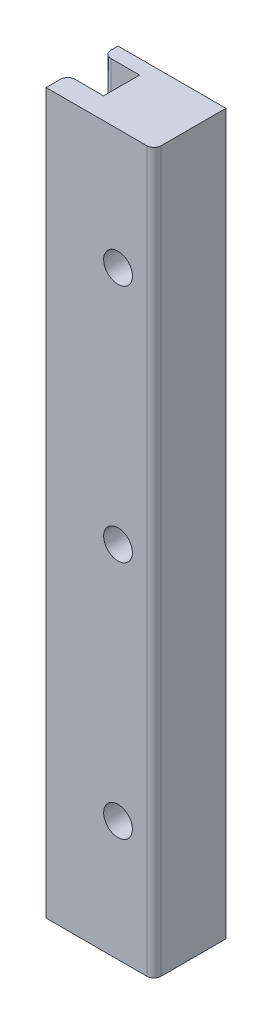
ISO-10303-21;
HEADER;
FILE_DESCRIPTION(('STEP AP214'),'2;1');
FILE_NAME('part.step','',(''),(''),'','','');
FILE_SCHEMA(('AUTOMOTIVE_DESIGN { 1 0 10303 214 1 1 1 1 }'));
ENDSEC;
DATA;
#1=APPLICATION_CONTEXT('core data for automotive mechanical design processes');
#2=APPLICATION_PROTOCOL_DEFINITION('international standard','automotive_design',2000,#1);
#3=PRODUCT_CONTEXT('',#1,'mechanical');
#4=PRODUCT('Part','Part','',(#3));
#5=PRODUCT_RELATED_PRODUCT_CATEGORY('part','',(#4));
#6=PRODUCT_DEFINITION_FORMATION('','',#4);
#7=PRODUCT_DEFINITION_CONTEXT('part definition',#1,'design');
#8=PRODUCT_DEFINITION('design','',#6,#7);
#9=PRODUCT_DEFINITION_SHAPE('','',#8);
#10=(LENGTH_UNIT() NAMED_UNIT(*) SI_UNIT(.MILLI.,.METRE.));
#11=(NAMED_UNIT(*) PLANE_ANGLE_UNIT() SI_UNIT($,.RADIAN.));
#12=(NAMED_UNIT(*) SI_UNIT($,.STERADIAN.) SOLID_ANGLE_UNIT());
#13=UNCERTAINTY_MEASURE_WITH_UNIT(LENGTH_MEASURE(1.E-05),#10,'distance_accuracy_value','');
#14=(GEOMETRIC_REPRESENTATION_CONTEXT(3) GLOBAL_UNCERTAINTY_ASSIGNED_CONTEXT((#13)) GLOBAL_UNIT_ASSIGNED_CONTEXT((#10,
#11,#12)) REPRESENTATION_CONTEXT('',''));
#15=CARTESIAN_POINT('',(0.,0.,0.));
#16=DIRECTION('',(0.,0.,1.));
#17=DIRECTION('',(1.,0.,0.));
#18=AXIS2_PLACEMENT_3D('',#15,#16,#17);
#19=CARTESIAN_POINT('',(0.,100.,2.));
#20=DIRECTION('',(1.,0.,0.));
#21=DIRECTION('',(0.,0.,-1.));
#22=AXIS2_PLACEMENT_3D('',#19,#20,#21);
#23=PLANE('',#22);
#24=DIRECTION('',(0.,0.,1.));
#25=VECTOR('',#24,1.);
#26=CARTESIAN_POINT('',(0.,0.,2.));
#27=LINE('',#26,#25);
#28=CARTESIAN_POINT('',(0.,0.,0.));
#29=VERTEX_POINT('',#28);
#30=CARTESIAN_POINT('',(0.,0.,1.));
#31=VERTEX_POINT('',#30);
#32=EDGE_CURVE('E156',#29,#31,#27,.T.);
#33=ORIENTED_EDGE('',*,*,#32,.T.);
#34=DIRECTION('',(0.,-1.,0.));
#35=VECTOR('',#34,1.);
#36=CARTESIAN_POINT('',(0.,100.,1.));
#37=LINE('',#36,#35);
#38=CARTESIAN_POINT('',(0.,100.,1.));
#39=VERTEX_POINT('',#38);
#40=EDGE_CURVE('E11',#31,#39,#37,.F.);
#41=ORIENTED_EDGE('',*,*,#40,.T.);
#42=DIRECTION('',(0.,0.,1.));
#43=VECTOR('',#42,1.);
#44=CARTESIAN_POINT('',(0.,100.,2.));
#45=LINE('',#44,#43);
#46=CARTESIAN_POINT('',(0.,100.,0.));
#47=VERTEX_POINT('',#46);
#48=EDGE_CURVE('E128',#47,#39,#45,.T.);
#49=ORIENTED_EDGE('',*,*,#48,.F.);
#50=DIRECTION('',(0.,-1.,0.));
#51=VECTOR('',#50,1.);
#52=CARTESIAN_POINT('',(0.,100.,0.));
#53=LINE('',#52,#51);
#54=EDGE_CURVE('E155',#47,#29,#53,.T.);
#55=ORIENTED_EDGE('',*,*,#54,.T.);
#56=EDGE_LOOP('',(#33,#41,#49,#55));
#57=FACE_BOUND('',#56,.T.);
#58=ADVANCED_FACE('F33',(#57),#23,.F.);
#59=CARTESIAN_POINT('',(5.,100.,2.));
#60=DIRECTION('',(0.,0.,-1.));
#61=DIRECTION('',(-1.,0.,0.));
#62=AXIS2_PLACEMENT_3D('',#59,#60,#61);
#63=PLANE('',#62);
#64=DIRECTION('',(1.,0.,0.));
#65=VECTOR('',#64,1.);
#66=CARTESIAN_POINT('',(5.,100.,2.));
#67=LINE('',#66,#65);
#68=CARTESIAN_POINT('',(1.,100.,2.));
#69=VERTEX_POINT('',#68);
#70=CARTESIAN_POINT('',(5.,100.,2.));
#71=VERTEX_POINT('',#70);
#72=EDGE_CURVE('E115',#69,#71,#67,.T.);
#73=ORIENTED_EDGE('',*,*,#72,.F.);
#74=DIRECTION('',(0.,-1.,0.));
#75=VECTOR('',#74,1.);
#76=CARTESIAN_POINT('',(1.,100.,2.));
#77=LINE('',#76,#75);
#78=CARTESIAN_POINT('',(1.,0.,2.));
#79=VERTEX_POINT('',#78);
#80=EDGE_CURVE('E41',#69,#79,#77,.T.);
#81=ORIENTED_EDGE('',*,*,#80,.T.);
#82=DIRECTION('',(1.,0.,0.));
#83=VECTOR('',#82,1.);
#84=CARTESIAN_POINT('',(5.,0.,2.));
#85=LINE('',#84,#83);
#86=CARTESIAN_POINT('',(5.,0.,2.));
#87=VERTEX_POINT('',#86);
#88=EDGE_CURVE('E134',#79,#87,#85,.T.);
#89=ORIENTED_EDGE('',*,*,#88,.T.);
#90=DIRECTION('',(0.,-1.,0.));
#91=VECTOR('',#90,1.);
#92=CARTESIAN_POINT('',(5.,100.,2.));
#93=LINE('',#92,#91);
#94=EDGE_CURVE('E131',#71,#87,#93,.T.);
#95=ORIENTED_EDGE('',*,*,#94,.F.);
#96=EDGE_LOOP('',(#73,#81,#89,#95));
#97=FACE_BOUND('',#96,.T.);
#98=ADVANCED_FACE('F132',(#97),#63,.F.);
#99=CARTESIAN_POINT('',(5.,100.,7.));
#100=DIRECTION('',(1.,0.,0.));
#101=DIRECTION('',(0.,0.,-1.));
#102=AXIS2_PLACEMENT_3D('',#99,#100,#101);
#103=PLANE('',#102);
#104=DIRECTION('',(0.,0.,1.));
#105=VECTOR('',#104,1.);
#106=CARTESIAN_POINT('',(5.,0.,7.));
#107=LINE('',#106,#105);
#108=CARTESIAN_POINT('',(5.,0.,7.));
#109=VERTEX_POINT('',#108);
#110=EDGE_CURVE('E161',#87,#109,#107,.T.);
#111=ORIENTED_EDGE('',*,*,#110,.T.);
#112=DIRECTION('',(0.,-1.,0.));
#113=VECTOR('',#112,1.);
#114=CARTESIAN_POINT('',(5.,100.,7.));
#115=LINE('',#114,#113);
#116=CARTESIAN_POINT('',(5.,100.,7.));
#117=VERTEX_POINT('',#116);
#118=EDGE_CURVE('E138',#117,#109,#115,.T.);
#119=ORIENTED_EDGE('',*,*,#118,.F.);
#120=DIRECTION('',(0.,0.,1.));
#121=VECTOR('',#120,1.);
#122=CARTESIAN_POINT('',(5.,100.,7.));
#123=LINE('',#122,#121);
#124=EDGE_CURVE('E120',#71,#117,#123,.T.);
#125=ORIENTED_EDGE('',*,*,#124,.F.);
#126=ORIENTED_EDGE('',*,*,#94,.T.);
#127=EDGE_LOOP('',(#111,#119,#125,#126));
#128=FACE_BOUND('',#127,.T.);
#129=ADVANCED_FACE('F140',(#128),#103,.F.);
#130=CARTESIAN_POINT('',(0.,100.,7.));
#131=DIRECTION('',(0.,0.,1.));
#132=DIRECTION('',(1.,0.,0.));
#133=AXIS2_PLACEMENT_3D('',#130,#131,#132);
#134=PLANE('',#133);
#135=DIRECTION('',(-1.,0.,0.));
#136=VECTOR('',#135,1.);
#137=CARTESIAN_POINT('',(0.,0.,7.));
#138=LINE('',#137,#136);
#139=CARTESIAN_POINT('',(1.,0.,7.));
#140=VERTEX_POINT('',#139);
#141=EDGE_CURVE('E163',#109,#140,#138,.T.);
#142=ORIENTED_EDGE('',*,*,#141,.T.);
#143=DIRECTION('',(0.,-1.,0.));
#144=VECTOR('',#143,1.);
#145=CARTESIAN_POINT('',(1.,100.,7.));
#146=LINE('',#145,#144);
#147=CARTESIAN_POINT('',(1.,100.,7.));
#148=VERTEX_POINT('',#147);
#149=EDGE_CURVE('E56',#140,#148,#146,.F.);
#150=ORIENTED_EDGE('',*,*,#149,.T.);
#151=DIRECTION('',(-1.,0.,0.));
#152=VECTOR('',#151,1.);
#153=CARTESIAN_POINT('',(0.,100.,7.));
#154=LINE('',#153,#152);
#155=EDGE_CURVE('E142',#117,#148,#154,.T.);
#156=ORIENTED_EDGE('',*,*,#155,.F.);
#157=ORIENTED_EDGE('',*,*,#118,.T.);
#158=EDGE_LOOP('',(#142,#150,#156,#157));
#159=FACE_BOUND('',#158,.T.);
#160=ADVANCED_FACE('F206',(#159),#134,.F.);
#161=CARTESIAN_POINT('',(0.,100.,10.));
#162=DIRECTION('',(1.,0.,0.));
#163=DIRECTION('',(0.,0.,-1.));
#164=AXIS2_PLACEMENT_3D('',#161,#162,#163);
#165=PLANE('',#164);
#166=DIRECTION('',(0.,0.,1.));
#167=VECTOR('',#166,1.);
#168=CARTESIAN_POINT('',(0.,100.,10.));
#169=LINE('',#168,#167);
#170=CARTESIAN_POINT('',(0.,100.,8.));
#171=VERTEX_POINT('',#170);
#172=CARTESIAN_POINT('',(0.,100.,10.));
#173=VERTEX_POINT('',#172);
#174=EDGE_CURVE('E144',#171,#173,#169,.T.);
#175=ORIENTED_EDGE('',*,*,#174,.F.);
#176=DIRECTION('',(0.,-1.,0.));
#177=VECTOR('',#176,1.);
#178=CARTESIAN_POINT('',(0.,100.,8.));
#179=LINE('',#178,#177);
#180=CARTESIAN_POINT('',(0.,0.,8.));
#181=VERTEX_POINT('',#180);
#182=EDGE_CURVE('E197',#171,#181,#179,.T.);
#183=ORIENTED_EDGE('',*,*,#182,.T.);
#184=DIRECTION('',(0.,0.,1.));
#185=VECTOR('',#184,1.);
#186=CARTESIAN_POINT('',(0.,0.,10.));
#187=LINE('',#186,#185);
#188=CARTESIAN_POINT('',(0.,0.,10.));
#189=VERTEX_POINT('',#188);
#190=EDGE_CURVE('E165',#181,#189,#187,.T.);
#191=ORIENTED_EDGE('',*,*,#190,.T.);
#192=DIRECTION('',(0.,-1.,0.));
#193=VECTOR('',#192,1.);
#194=CARTESIAN_POINT('',(0.,100.,10.));
#195=LINE('',#194,#193);
#196=EDGE_CURVE('E179',#173,#189,#195,.T.);
#197=ORIENTED_EDGE('',*,*,#196,.F.);
#198=EDGE_LOOP('',(#175,#183,#191,#197));
#199=FACE_BOUND('',#198,.T.);
#200=ADVANCED_FACE('F212',(#199),#165,.F.);
#201=CARTESIAN_POINT('',(7.,100.,10.));
#202=DIRECTION('',(0.,0.,-1.));
#203=DIRECTION('',(-1.,0.,0.));
#204=AXIS2_PLACEMENT_3D('',#201,#202,#203);
#205=PLANE('',#204);
#206=CARTESIAN_POINT('',(10.,16.7,10.));
#207=DIRECTION('',(0.,0.,1.));
#208=DIRECTION('',(1.,0.,0.));
#209=AXIS2_PLACEMENT_3D('',#206,#207,#208);
#210=CIRCLE('',#209,2.);
#211=CARTESIAN_POINT('',(12.,16.7,10.));
#212=VERTEX_POINT('',#211);
#213=EDGE_CURVE('E248',#212,#212,#210,.T.);
#214=ORIENTED_EDGE('',*,*,#213,.F.);
#215=EDGE_LOOP('',(#214));
#216=FACE_BOUND('',#215,.T.);
#217=CARTESIAN_POINT('',(10.,83.3,10.));
#218=DIRECTION('',(0.,0.,1.));
#219=DIRECTION('',(1.,0.,0.));
#220=AXIS2_PLACEMENT_3D('',#217,#218,#219);
#221=CIRCLE('',#220,2.);
#222=CARTESIAN_POINT('',(12.,83.3,10.));
#223=VERTEX_POINT('',#222);
#224=EDGE_CURVE('E245',#223,#223,#221,.T.);
#225=ORIENTED_EDGE('',*,*,#224,.F.);
#226=EDGE_LOOP('',(#225));
#227=FACE_BOUND('',#226,.T.);
#228=CARTESIAN_POINT('',(10.,50.,10.));
#229=DIRECTION('',(0.,0.,1.));
#230=DIRECTION('',(1.,0.,0.));
#231=AXIS2_PLACEMENT_3D('',#228,#229,#230);
#232=CIRCLE('',#231,2.);
#233=CARTESIAN_POINT('',(12.,50.,10.));
#234=VERTEX_POINT('',#233);
#235=EDGE_CURVE('E239',#234,#234,#232,.T.);
#236=ORIENTED_EDGE('',*,*,#235,.F.);
#237=EDGE_LOOP('',(#236));
#238=FACE_BOUND('',#237,.T.);
#239=DIRECTION('',(1.,0.,0.));
#240=VECTOR('',#239,1.);
#241=CARTESIAN_POINT('',(7.,0.,10.));
#242=LINE('',#241,#240);
#243=CARTESIAN_POINT('',(14.,0.,10.));
#244=VERTEX_POINT('',#243);
#245=EDGE_CURVE('E167',#189,#244,#242,.T.);
#246=ORIENTED_EDGE('',*,*,#245,.T.);
#247=DIRECTION('',(0.,-1.,0.));
#248=VECTOR('',#247,1.);
#249=CARTESIAN_POINT('',(14.,100.,10.));
#250=LINE('',#249,#248);
#251=CARTESIAN_POINT('',(14.,100.,10.));
#252=VERTEX_POINT('',#251);
#253=EDGE_CURVE('E191',#244,#252,#250,.F.);
#254=ORIENTED_EDGE('',*,*,#253,.T.);
#255=DIRECTION('',(1.,0.,0.));
#256=VECTOR('',#255,1.);
#257=CARTESIAN_POINT('',(7.,100.,10.));
#258=LINE('',#257,#256);
#259=EDGE_CURVE('E149',#173,#252,#258,.T.);
#260=ORIENTED_EDGE('',*,*,#259,.F.);
#261=ORIENTED_EDGE('',*,*,#196,.T.);
#262=EDGE_LOOP('',(#246,#254,#260,#261));
#263=FACE_BOUND('',#262,.T.);
#264=ADVANCED_FACE('F218',(#216,#227,#238,#263),#205,.F.);
#265=CARTESIAN_POINT('',(15.,100.,0.));
#266=DIRECTION('',(-1.,0.,0.));
#267=DIRECTION('',(0.,0.,1.));
#268=AXIS2_PLACEMENT_3D('',#265,#266,#267);
#269=PLANE('',#268);
#270=DIRECTION('',(0.,0.,-1.));
#271=VECTOR('',#270,1.);
#272=CARTESIAN_POINT('',(15.,100.,10.));
#273=LINE('',#272,#271);
#274=CARTESIAN_POINT('',(15.,100.,9.));
#275=VERTEX_POINT('',#274);
#276=CARTESIAN_POINT('',(15.,100.,0.));
#277=VERTEX_POINT('',#276);
#278=EDGE_CURVE('E151',#275,#277,#273,.T.);
#279=ORIENTED_EDGE('',*,*,#278,.F.);
#280=DIRECTION('',(0.,-1.,0.));
#281=VECTOR('',#280,1.);
#282=CARTESIAN_POINT('',(15.,100.,9.));
#283=LINE('',#282,#281);
#284=CARTESIAN_POINT('',(15.,0.,9.));
#285=VERTEX_POINT('',#284);
#286=EDGE_CURVE('E137',#275,#285,#283,.T.);
#287=ORIENTED_EDGE('',*,*,#286,.T.);
#288=DIRECTION('',(0.,0.,-1.));
#289=VECTOR('',#288,1.);
#290=CARTESIAN_POINT('',(15.,0.,0.));
#291=LINE('',#290,#289);
#292=CARTESIAN_POINT('',(15.,0.,0.));
#293=VERTEX_POINT('',#292);
#294=EDGE_CURVE('E170',#285,#293,#291,.T.);
#295=ORIENTED_EDGE('',*,*,#294,.T.);
#296=DIRECTION('',(0.,-1.,0.));
#297=VECTOR('',#296,1.);
#298=CARTESIAN_POINT('',(15.,100.,0.));
#299=LINE('',#298,#297);
#300=EDGE_CURVE('E176',#277,#293,#299,.T.);
#301=ORIENTED_EDGE('',*,*,#300,.F.);
#302=EDGE_LOOP('',(#279,#287,#295,#301));
#303=FACE_BOUND('',#302,.T.);
#304=ADVANCED_FACE('F225',(#303),#269,.F.);
#305=CARTESIAN_POINT('',(0.,100.,0.));
#306=DIRECTION('',(0.,0.,1.));
#307=DIRECTION('',(1.,0.,0.));
#308=AXIS2_PLACEMENT_3D('',#305,#306,#307);
#309=PLANE('',#308);
#310=CARTESIAN_POINT('',(10.,16.7,0.));
#311=DIRECTION('',(0.,0.,1.));
#312=DIRECTION('',(1.,0.,0.));
#313=AXIS2_PLACEMENT_3D('',#310,#311,#312);
#314=CIRCLE('',#313,2.);
#315=CARTESIAN_POINT('',(12.,16.7,0.));
#316=VERTEX_POINT('',#315);
#317=EDGE_CURVE('E159',#316,#316,#314,.T.);
#318=ORIENTED_EDGE('',*,*,#317,.T.);
#319=EDGE_LOOP('',(#318));
#320=FACE_BOUND('',#319,.T.);
#321=CARTESIAN_POINT('',(10.,83.3,0.));
#322=DIRECTION('',(0.,0.,1.));
#323=DIRECTION('',(1.,0.,0.));
#324=AXIS2_PLACEMENT_3D('',#321,#322,#323);
#325=CIRCLE('',#324,2.);
#326=CARTESIAN_POINT('',(12.,83.3,0.));
#327=VERTEX_POINT('',#326);
#328=EDGE_CURVE('E242',#327,#327,#325,.T.);
#329=ORIENTED_EDGE('',*,*,#328,.T.);
#330=EDGE_LOOP('',(#329));
#331=FACE_BOUND('',#330,.T.);
#332=CARTESIAN_POINT('',(10.,50.,0.));
#333=DIRECTION('',(0.,0.,1.));
#334=DIRECTION('',(1.,0.,0.));
#335=AXIS2_PLACEMENT_3D('',#332,#333,#334);
#336=CIRCLE('',#335,2.);
#337=CARTESIAN_POINT('',(12.,50.,0.));
#338=VERTEX_POINT('',#337);
#339=EDGE_CURVE('E236',#338,#338,#336,.T.);
#340=ORIENTED_EDGE('',*,*,#339,.T.);
#341=EDGE_LOOP('',(#340));
#342=FACE_BOUND('',#341,.T.);
#343=DIRECTION('',(-1.,0.,0.));
#344=VECTOR('',#343,1.);
#345=CARTESIAN_POINT('',(0.,0.,0.));
#346=LINE('',#345,#344);
#347=EDGE_CURVE('E172',#293,#29,#346,.T.);
#348=ORIENTED_EDGE('',*,*,#347,.T.);
#349=ORIENTED_EDGE('',*,*,#54,.F.);
#350=DIRECTION('',(-1.,0.,0.));
#351=VECTOR('',#350,1.);
#352=CARTESIAN_POINT('',(0.,100.,0.));
#353=LINE('',#352,#351);
#354=EDGE_CURVE('E153',#277,#47,#353,.T.);
#355=ORIENTED_EDGE('',*,*,#354,.F.);
#356=ORIENTED_EDGE('',*,*,#300,.T.);
#357=EDGE_LOOP('',(#348,#349,#355,#356));
#358=FACE_BOUND('',#357,.T.);
#359=ADVANCED_FACE('F230',(#320,#331,#342,#358),#309,.F.);
#360=CARTESIAN_POINT('',(0.,100.,0.));
#361=DIRECTION('',(0.,-1.,0.));
#362=DIRECTION('',(0.,0.,-1.));
#363=AXIS2_PLACEMENT_3D('',#360,#361,#362);
#364=PLANE('',#363);
#365=ORIENTED_EDGE('',*,*,#259,.T.);
#366=CARTESIAN_POINT('',(14.,100.,9.));
#367=DIRECTION('',(0.,-1.,0.));
#368=DIRECTION('',(0.,0.,-1.));
#369=AXIS2_PLACEMENT_3D('',#366,#367,#368);
#370=CIRCLE('',#369,1.);
#371=EDGE_CURVE('E195',#252,#275,#370,.F.);
#372=ORIENTED_EDGE('',*,*,#371,.T.);
#373=ORIENTED_EDGE('',*,*,#278,.T.);
#374=ORIENTED_EDGE('',*,*,#354,.T.);
#375=ORIENTED_EDGE('',*,*,#48,.T.);
#376=CARTESIAN_POINT('',(1.,100.,1.));
#377=DIRECTION('',(0.,-1.,0.));
#378=DIRECTION('',(0.,0.,-1.));
#379=AXIS2_PLACEMENT_3D('',#376,#377,#378);
#380=CIRCLE('',#379,1.);
#381=EDGE_CURVE('E124',#39,#69,#380,.F.);
#382=ORIENTED_EDGE('',*,*,#381,.T.);
#383=ORIENTED_EDGE('',*,*,#72,.T.);
#384=ORIENTED_EDGE('',*,*,#124,.T.);
#385=ORIENTED_EDGE('',*,*,#155,.T.);
#386=CARTESIAN_POINT('',(1.,100.,8.));
#387=DIRECTION('',(0.,-1.,0.));
#388=DIRECTION('',(0.,0.,-1.));
#389=AXIS2_PLACEMENT_3D('',#386,#387,#388);
#390=CIRCLE('',#389,1.);
#391=EDGE_CURVE('E48',#148,#171,#390,.F.);
#392=ORIENTED_EDGE('',*,*,#391,.T.);
#393=ORIENTED_EDGE('',*,*,#174,.T.);
#394=EDGE_LOOP('',(#365,#372,#373,#374,#375,#382,#383,#384,#385,#392,#393));
#395=FACE_BOUND('',#394,.T.);
#396=ADVANCED_FACE('F118',(#395),#364,.F.);
#397=CARTESIAN_POINT('',(0.,0.,0.));
#398=DIRECTION('',(0.,-1.,0.));
#399=DIRECTION('',(0.,0.,-1.));
#400=AXIS2_PLACEMENT_3D('',#397,#398,#399);
#401=PLANE('',#400);
#402=ORIENTED_EDGE('',*,*,#294,.F.);
#403=CARTESIAN_POINT('',(14.,0.,9.));
#404=DIRECTION('',(0.,-1.,0.));
#405=DIRECTION('',(0.,0.,-1.));
#406=AXIS2_PLACEMENT_3D('',#403,#404,#405);
#407=CIRCLE('',#406,1.);
#408=EDGE_CURVE('E189',#285,#244,#407,.T.);
#409=ORIENTED_EDGE('',*,*,#408,.T.);
#410=ORIENTED_EDGE('',*,*,#245,.F.);
#411=ORIENTED_EDGE('',*,*,#190,.F.);
#412=CARTESIAN_POINT('',(1.,0.,8.));
#413=DIRECTION('',(0.,-1.,0.));
#414=DIRECTION('',(0.,0.,-1.));
#415=AXIS2_PLACEMENT_3D('',#412,#413,#414);
#416=CIRCLE('',#415,1.);
#417=EDGE_CURVE('E187',#181,#140,#416,.T.);
#418=ORIENTED_EDGE('',*,*,#417,.T.);
#419=ORIENTED_EDGE('',*,*,#141,.F.);
#420=ORIENTED_EDGE('',*,*,#110,.F.);
#421=ORIENTED_EDGE('',*,*,#88,.F.);
#422=CARTESIAN_POINT('',(1.,0.,1.));
#423=DIRECTION('',(0.,-1.,0.));
#424=DIRECTION('',(0.,0.,-1.));
#425=AXIS2_PLACEMENT_3D('',#422,#423,#424);
#426=CIRCLE('',#425,1.);
#427=EDGE_CURVE('E185',#79,#31,#426,.T.);
#428=ORIENTED_EDGE('',*,*,#427,.T.);
#429=ORIENTED_EDGE('',*,*,#32,.F.);
#430=ORIENTED_EDGE('',*,*,#347,.F.);
#431=EDGE_LOOP('',(#402,#409,#410,#411,#418,#419,#420,#421,#428,#429,#430));
#432=FACE_BOUND('',#431,.T.);
#433=ADVANCED_FACE('F203',(#432),#401,.T.);
#434=CARTESIAN_POINT('',(14.,100.,9.));
#435=DIRECTION('',(0.,-1.,0.));
#436=DIRECTION('',(0.,0.,-1.));
#437=AXIS2_PLACEMENT_3D('',#434,#435,#436);
#438=CYLINDRICAL_SURFACE('',#437,1.);
#439=ORIENTED_EDGE('',*,*,#371,.F.);
#440=ORIENTED_EDGE('',*,*,#253,.F.);
#441=ORIENTED_EDGE('',*,*,#408,.F.);
#442=ORIENTED_EDGE('',*,*,#286,.F.);
#443=EDGE_LOOP('',(#439,#440,#441,#442));
#444=FACE_BOUND('',#443,.T.);
#445=ADVANCED_FACE('F223',(#444),#438,.T.);
#446=CARTESIAN_POINT('',(1.,100.,8.));
#447=DIRECTION('',(0.,-1.,0.));
#448=DIRECTION('',(0.,0.,-1.));
#449=AXIS2_PLACEMENT_3D('',#446,#447,#448);
#450=CYLINDRICAL_SURFACE('',#449,1.);
#451=ORIENTED_EDGE('',*,*,#391,.F.);
#452=ORIENTED_EDGE('',*,*,#149,.F.);
#453=ORIENTED_EDGE('',*,*,#417,.F.);
#454=ORIENTED_EDGE('',*,*,#182,.F.);
#455=EDGE_LOOP('',(#451,#452,#453,#454));
#456=FACE_BOUND('',#455,.T.);
#457=ADVANCED_FACE('F209',(#456),#450,.T.);
#458=CARTESIAN_POINT('',(1.,100.,1.));
#459=DIRECTION('',(0.,-1.,0.));
#460=DIRECTION('',(0.,0.,-1.));
#461=AXIS2_PLACEMENT_3D('',#458,#459,#460);
#462=CYLINDRICAL_SURFACE('',#461,1.);
#463=ORIENTED_EDGE('',*,*,#381,.F.);
#464=ORIENTED_EDGE('',*,*,#40,.F.);
#465=ORIENTED_EDGE('',*,*,#427,.F.);
#466=ORIENTED_EDGE('',*,*,#80,.F.);
#467=EDGE_LOOP('',(#463,#464,#465,#466));
#468=FACE_BOUND('',#467,.T.);
#469=ADVANCED_FACE('F35',(#468),#462,.T.);
#470=CARTESIAN_POINT('',(10.,50.,0.));
#471=DIRECTION('',(0.,0.,1.));
#472=DIRECTION('',(1.,0.,0.));
#473=AXIS2_PLACEMENT_3D('',#470,#471,#472);
#474=CYLINDRICAL_SURFACE('',#473,2.);
#475=ORIENTED_EDGE('',*,*,#339,.F.);
#476=EDGE_LOOP('',(#475));
#477=FACE_BOUND('',#476,.T.);
#478=ORIENTED_EDGE('',*,*,#235,.T.);
#479=EDGE_LOOP('',(#478));
#480=FACE_BOUND('',#479,.T.);
#481=ADVANCED_FACE('F270',(#477,#480),#474,.F.);
#482=CARTESIAN_POINT('',(10.,83.3,0.));
#483=DIRECTION('',(0.,0.,1.));
#484=DIRECTION('',(1.,0.,0.));
#485=AXIS2_PLACEMENT_3D('',#482,#483,#484);
#486=CYLINDRICAL_SURFACE('',#485,2.);
#487=ORIENTED_EDGE('',*,*,#328,.F.);
#488=EDGE_LOOP('',(#487));
#489=FACE_BOUND('',#488,.T.);
#490=ORIENTED_EDGE('',*,*,#224,.T.);
#491=EDGE_LOOP('',(#490));
#492=FACE_BOUND('',#491,.T.);
#493=ADVANCED_FACE('F259',(#489,#492),#486,.F.);
#494=CARTESIAN_POINT('',(10.,16.7,0.));
#495=DIRECTION('',(0.,0.,1.));
#496=DIRECTION('',(1.,0.,0.));
#497=AXIS2_PLACEMENT_3D('',#494,#495,#496);
#498=CYLINDRICAL_SURFACE('',#497,2.);
#499=ORIENTED_EDGE('',*,*,#317,.F.);
#500=EDGE_LOOP('',(#499));
#501=FACE_BOUND('',#500,.T.);
#502=ORIENTED_EDGE('',*,*,#213,.T.);
#503=EDGE_LOOP('',(#502));
#504=FACE_BOUND('',#503,.T.);
#505=ADVANCED_FACE('F256',(#501,#504),#498,.F.);
#506=CLOSED_SHELL('',(#58,#98,#129,#160,#200,#264,#304,#359,#396,#433,#445,#457,#469,#481,#493,#505));
#507=MANIFOLD_SOLID_BREP('B2',#506);
#508=ADVANCED_BREP_SHAPE_REPRESENTATION('',(#18,#507),#14);
#509=SHAPE_DEFINITION_REPRESENTATION(#9,#508);
ENDSEC;
END-ISO-10303-21;
